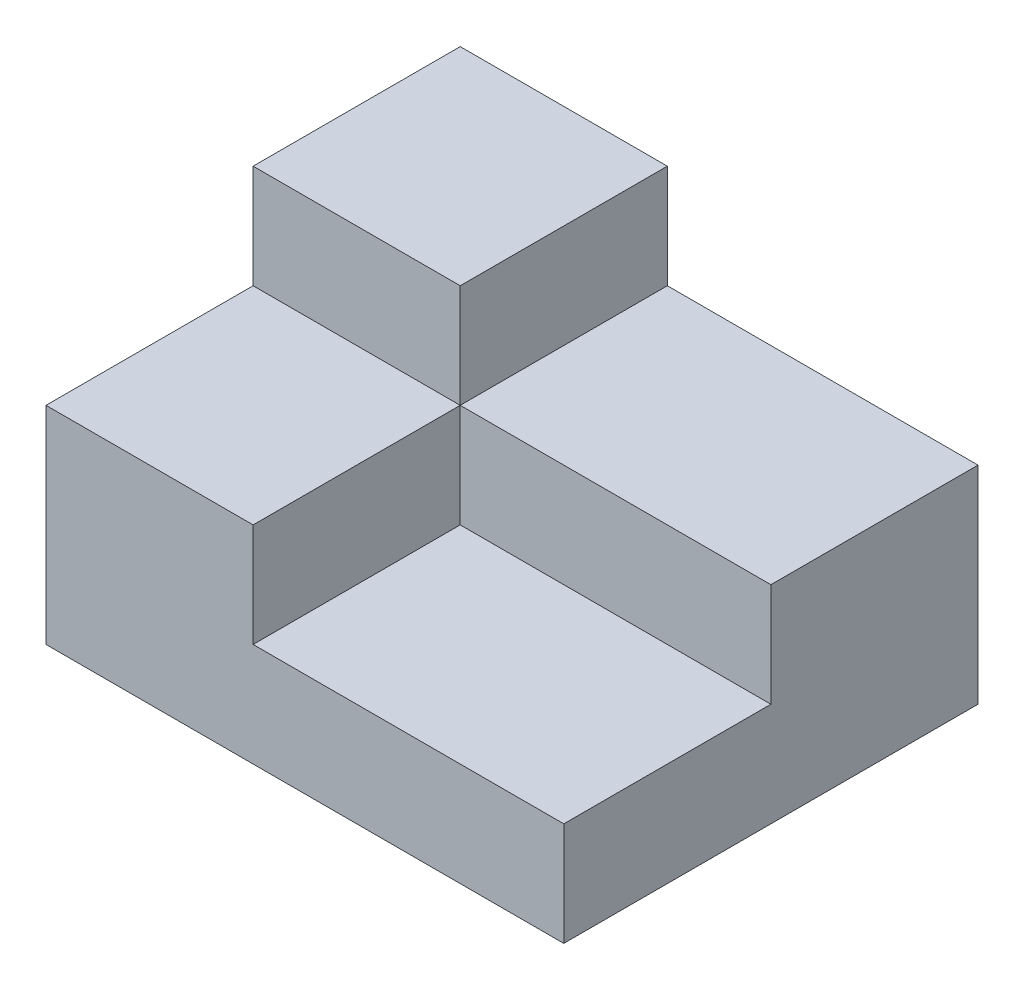
ISO-10303-21;
HEADER;
FILE_DESCRIPTION(('STEP AP214'),'2;1');
FILE_NAME('part.step','',(''),(''),'','','');
FILE_SCHEMA(('AUTOMOTIVE_DESIGN { 1 0 10303 214 1 1 1 1 }'));
ENDSEC;
DATA;
#1=APPLICATION_CONTEXT('core data for automotive mechanical design processes');
#2=APPLICATION_PROTOCOL_DEFINITION('international standard','automotive_design',2000,#1);
#3=PRODUCT_CONTEXT('',#1,'mechanical');
#4=PRODUCT('Part','Part','',(#3));
#5=PRODUCT_RELATED_PRODUCT_CATEGORY('part','',(#4));
#6=PRODUCT_DEFINITION_FORMATION('','',#4);
#7=PRODUCT_DEFINITION_CONTEXT('part definition',#1,'design');
#8=PRODUCT_DEFINITION('design','',#6,#7);
#9=PRODUCT_DEFINITION_SHAPE('','',#8);
#10=(LENGTH_UNIT() NAMED_UNIT(*) SI_UNIT(.MILLI.,.METRE.));
#11=(NAMED_UNIT(*) PLANE_ANGLE_UNIT() SI_UNIT($,.RADIAN.));
#12=(NAMED_UNIT(*) SI_UNIT($,.STERADIAN.) SOLID_ANGLE_UNIT());
#13=UNCERTAINTY_MEASURE_WITH_UNIT(LENGTH_MEASURE(1.E-05),#10,'distance_accuracy_value','');
#14=(GEOMETRIC_REPRESENTATION_CONTEXT(3) GLOBAL_UNCERTAINTY_ASSIGNED_CONTEXT((#13)) GLOBAL_UNIT_ASSIGNED_CONTEXT((#10,
#11,#12)) REPRESENTATION_CONTEXT('',''));
#15=CARTESIAN_POINT('',(0.,0.,0.));
#16=DIRECTION('',(0.,0.,1.));
#17=DIRECTION('',(1.,0.,0.));
#18=AXIS2_PLACEMENT_3D('',#15,#16,#17);
#19=CARTESIAN_POINT('',(0.,50.8,0.));
#20=DIRECTION('',(0.,1.,0.));
#21=DIRECTION('',(0.,0.,1.));
#22=AXIS2_PLACEMENT_3D('',#19,#20,#21);
#23=PLANE('',#22);
#24=DIRECTION('',(0.,0.,-1.));
#25=VECTOR('',#24,1.);
#26=CARTESIAN_POINT('',(-12.7,50.8,-50.8));
#27=LINE('',#26,#25);
#28=CARTESIAN_POINT('',(-12.7,50.8,0.));
#29=VERTEX_POINT('',#28);
#30=CARTESIAN_POINT('',(-12.7,50.8,-50.8));
#31=VERTEX_POINT('',#30);
#32=EDGE_CURVE('E135',#29,#31,#27,.T.);
#33=ORIENTED_EDGE('',*,*,#32,.F.);
#34=DIRECTION('',(1.,0.,0.));
#35=VECTOR('',#34,1.);
#36=CARTESIAN_POINT('',(63.5,50.8,0.));
#37=LINE('',#36,#35);
#38=CARTESIAN_POINT('',(63.5,50.8,0.));
#39=VERTEX_POINT('',#38);
#40=EDGE_CURVE('E154',#29,#39,#37,.T.);
#41=ORIENTED_EDGE('',*,*,#40,.T.);
#42=DIRECTION('',(0.,0.,-1.));
#43=VECTOR('',#42,1.);
#44=CARTESIAN_POINT('',(63.5,50.8,-50.8));
#45=LINE('',#44,#43);
#46=CARTESIAN_POINT('',(63.5,50.8,-50.8));
#47=VERTEX_POINT('',#46);
#48=EDGE_CURVE('E156',#39,#47,#45,.T.);
#49=ORIENTED_EDGE('',*,*,#48,.T.);
#50=DIRECTION('',(-1.,0.,0.));
#51=VECTOR('',#50,1.);
#52=CARTESIAN_POINT('',(63.5,50.8,-50.8));
#53=LINE('',#52,#51);
#54=EDGE_CURVE('E54',#47,#31,#53,.T.);
#55=ORIENTED_EDGE('',*,*,#54,.T.);
#56=EDGE_LOOP('',(#33,#41,#49,#55));
#57=FACE_BOUND('',#56,.T.);
#58=ADVANCED_FACE('F39',(#57),#23,.T.);
#59=CARTESIAN_POINT('',(0.,25.4,0.));
#60=DIRECTION('',(0.,-1.,0.));
#61=DIRECTION('',(0.,0.,-1.));
#62=AXIS2_PLACEMENT_3D('',#59,#60,#61);
#63=PLANE('',#62);
#64=DIRECTION('',(1.,0.,0.));
#65=VECTOR('',#64,1.);
#66=CARTESIAN_POINT('',(63.5,25.4,0.));
#67=LINE('',#66,#65);
#68=CARTESIAN_POINT('',(-12.7,25.4,0.));
#69=VERTEX_POINT('',#68);
#70=CARTESIAN_POINT('',(63.5,25.4,0.));
#71=VERTEX_POINT('',#70);
#72=EDGE_CURVE('E143',#69,#71,#67,.T.);
#73=ORIENTED_EDGE('',*,*,#72,.F.);
#74=DIRECTION('',(0.,0.,-1.));
#75=VECTOR('',#74,1.);
#76=CARTESIAN_POINT('',(-12.7,25.4,0.));
#77=LINE('',#76,#75);
#78=CARTESIAN_POINT('',(-12.7,25.4,50.8));
#79=VERTEX_POINT('',#78);
#80=EDGE_CURVE('E140',#79,#69,#77,.T.);
#81=ORIENTED_EDGE('',*,*,#80,.F.);
#82=DIRECTION('',(1.,0.,0.));
#83=VECTOR('',#82,1.);
#84=CARTESIAN_POINT('',(-63.5,25.4,50.8));
#85=LINE('',#84,#83);
#86=CARTESIAN_POINT('',(63.5,25.4,50.8));
#87=VERTEX_POINT('',#86);
#88=EDGE_CURVE('E173',#79,#87,#85,.T.);
#89=ORIENTED_EDGE('',*,*,#88,.T.);
#90=DIRECTION('',(0.,0.,-1.));
#91=VECTOR('',#90,1.);
#92=CARTESIAN_POINT('',(63.5,25.4,50.8));
#93=LINE('',#92,#91);
#94=EDGE_CURVE('E171',#87,#71,#93,.T.);
#95=ORIENTED_EDGE('',*,*,#94,.T.);
#96=EDGE_LOOP('',(#73,#81,#89,#95));
#97=FACE_BOUND('',#96,.T.);
#98=ADVANCED_FACE('F204',(#97),#63,.F.);
#99=CARTESIAN_POINT('',(63.5,25.4,50.8));
#100=DIRECTION('',(-1.,0.,0.));
#101=DIRECTION('',(0.,0.,1.));
#102=AXIS2_PLACEMENT_3D('',#99,#100,#101);
#103=PLANE('',#102);
#104=DIRECTION('',(0.,0.,-1.));
#105=VECTOR('',#104,1.);
#106=CARTESIAN_POINT('',(63.5,0.,50.8));
#107=LINE('',#106,#105);
#108=CARTESIAN_POINT('',(63.5,0.,50.8));
#109=VERTEX_POINT('',#108);
#110=CARTESIAN_POINT('',(63.5,0.,-50.8));
#111=VERTEX_POINT('',#110);
#112=EDGE_CURVE('E170',#109,#111,#107,.T.);
#113=ORIENTED_EDGE('',*,*,#112,.T.);
#114=DIRECTION('',(0.,-1.,0.));
#115=VECTOR('',#114,1.);
#116=CARTESIAN_POINT('',(63.5,25.4,-50.8));
#117=LINE('',#116,#115);
#118=EDGE_CURVE('E11',#47,#111,#117,.T.);
#119=ORIENTED_EDGE('',*,*,#118,.F.);
#120=ORIENTED_EDGE('',*,*,#48,.F.);
#121=DIRECTION('',(0.,-1.,0.));
#122=VECTOR('',#121,1.);
#123=CARTESIAN_POINT('',(63.5,50.8,0.));
#124=LINE('',#123,#122);
#125=EDGE_CURVE('E158',#39,#71,#124,.T.);
#126=ORIENTED_EDGE('',*,*,#125,.T.);
#127=ORIENTED_EDGE('',*,*,#94,.F.);
#128=DIRECTION('',(0.,-1.,0.));
#129=VECTOR('',#128,1.);
#130=CARTESIAN_POINT('',(63.5,25.4,50.8));
#131=LINE('',#130,#129);
#132=EDGE_CURVE('E176',#87,#109,#131,.T.);
#133=ORIENTED_EDGE('',*,*,#132,.T.);
#134=EDGE_LOOP('',(#113,#119,#120,#126,#127,#133));
#135=FACE_BOUND('',#134,.T.);
#136=ADVANCED_FACE('F41',(#135),#103,.F.);
#137=CARTESIAN_POINT('',(-63.5,25.4,-50.8));
#138=DIRECTION('',(0.,0.,1.));
#139=DIRECTION('',(1.,0.,0.));
#140=AXIS2_PLACEMENT_3D('',#137,#138,#139);
#141=PLANE('',#140);
#142=DIRECTION('',(-1.,0.,0.));
#143=VECTOR('',#142,1.);
#144=CARTESIAN_POINT('',(-63.5,0.,-50.8));
#145=LINE('',#144,#143);
#146=CARTESIAN_POINT('',(-63.5,0.,-50.8));
#147=VERTEX_POINT('',#146);
#148=EDGE_CURVE('E179',#111,#147,#145,.T.);
#149=ORIENTED_EDGE('',*,*,#148,.T.);
#150=DIRECTION('',(0.,-1.,0.));
#151=VECTOR('',#150,1.);
#152=CARTESIAN_POINT('',(-63.5,25.4,-50.8));
#153=LINE('',#152,#151);
#154=CARTESIAN_POINT('',(-63.5,76.2,-50.8));
#155=VERTEX_POINT('',#154);
#156=EDGE_CURVE('E47',#155,#147,#153,.T.);
#157=ORIENTED_EDGE('',*,*,#156,.F.);
#158=DIRECTION('',(-1.,0.,0.));
#159=VECTOR('',#158,1.);
#160=CARTESIAN_POINT('',(-63.5,76.2,-50.8));
#161=LINE('',#160,#159);
#162=CARTESIAN_POINT('',(-12.7,76.2,-50.8));
#163=VERTEX_POINT('',#162);
#164=EDGE_CURVE('E132',#163,#155,#161,.T.);
#165=ORIENTED_EDGE('',*,*,#164,.F.);
#166=DIRECTION('',(0.,-1.,0.));
#167=VECTOR('',#166,1.);
#168=CARTESIAN_POINT('',(-12.7,76.2,-50.8));
#169=LINE('',#168,#167);
#170=EDGE_CURVE('E145',#163,#31,#169,.T.);
#171=ORIENTED_EDGE('',*,*,#170,.T.);
#172=ORIENTED_EDGE('',*,*,#54,.F.);
#173=ORIENTED_EDGE('',*,*,#118,.T.);
#174=EDGE_LOOP('',(#149,#157,#165,#171,#172,#173));
#175=FACE_BOUND('',#174,.T.);
#176=ADVANCED_FACE('F221',(#175),#141,.F.);
#177=CARTESIAN_POINT('',(-63.5,25.4,50.8));
#178=DIRECTION('',(1.,0.,0.));
#179=DIRECTION('',(0.,0.,-1.));
#180=AXIS2_PLACEMENT_3D('',#177,#178,#179);
#181=PLANE('',#180);
#182=DIRECTION('',(0.,0.,1.));
#183=VECTOR('',#182,1.);
#184=CARTESIAN_POINT('',(-63.5,0.,50.8));
#185=LINE('',#184,#183);
#186=CARTESIAN_POINT('',(-63.5,0.,50.8));
#187=VERTEX_POINT('',#186);
#188=EDGE_CURVE('E181',#147,#187,#185,.T.);
#189=ORIENTED_EDGE('',*,*,#188,.T.);
#190=DIRECTION('',(0.,-1.,0.));
#191=VECTOR('',#190,1.);
#192=CARTESIAN_POINT('',(-63.5,25.4,50.8));
#193=LINE('',#192,#191);
#194=CARTESIAN_POINT('',(-63.5,50.8,50.8));
#195=VERTEX_POINT('',#194);
#196=EDGE_CURVE('E186',#195,#187,#193,.T.);
#197=ORIENTED_EDGE('',*,*,#196,.F.);
#198=DIRECTION('',(0.,0.,1.));
#199=VECTOR('',#198,1.);
#200=CARTESIAN_POINT('',(-63.5,50.8,-50.8));
#201=LINE('',#200,#199);
#202=CARTESIAN_POINT('',(-63.5,50.8,0.));
#203=VERTEX_POINT('',#202);
#204=EDGE_CURVE('E139',#203,#195,#201,.T.);
#205=ORIENTED_EDGE('',*,*,#204,.F.);
#206=DIRECTION('',(0.,-1.,0.));
#207=VECTOR('',#206,1.);
#208=CARTESIAN_POINT('',(-63.5,76.2,0.));
#209=LINE('',#208,#207);
#210=CARTESIAN_POINT('',(-63.5,76.2,0.));
#211=VERTEX_POINT('',#210);
#212=EDGE_CURVE('E120',#211,#203,#209,.T.);
#213=ORIENTED_EDGE('',*,*,#212,.F.);
#214=DIRECTION('',(0.,0.,1.));
#215=VECTOR('',#214,1.);
#216=CARTESIAN_POINT('',(-63.5,76.2,-50.8));
#217=LINE('',#216,#215);
#218=EDGE_CURVE('E126',#155,#211,#217,.T.);
#219=ORIENTED_EDGE('',*,*,#218,.F.);
#220=ORIENTED_EDGE('',*,*,#156,.T.);
#221=EDGE_LOOP('',(#189,#197,#205,#213,#219,#220));
#222=FACE_BOUND('',#221,.T.);
#223=ADVANCED_FACE('F137',(#222),#181,.F.);
#224=CARTESIAN_POINT('',(-63.5,25.4,50.8));
#225=DIRECTION('',(0.,0.,-1.));
#226=DIRECTION('',(-1.,0.,0.));
#227=AXIS2_PLACEMENT_3D('',#224,#225,#226);
#228=PLANE('',#227);
#229=DIRECTION('',(1.,0.,0.));
#230=VECTOR('',#229,1.);
#231=CARTESIAN_POINT('',(-63.5,0.,50.8));
#232=LINE('',#231,#230);
#233=EDGE_CURVE('E174',#187,#109,#232,.T.);
#234=ORIENTED_EDGE('',*,*,#233,.T.);
#235=ORIENTED_EDGE('',*,*,#132,.F.);
#236=ORIENTED_EDGE('',*,*,#88,.F.);
#237=DIRECTION('',(0.,-1.,0.));
#238=VECTOR('',#237,1.);
#239=CARTESIAN_POINT('',(-12.7,50.8,50.8));
#240=LINE('',#239,#238);
#241=CARTESIAN_POINT('',(-12.7,50.8,50.8));
#242=VERTEX_POINT('',#241);
#243=EDGE_CURVE('E167',#242,#79,#240,.T.);
#244=ORIENTED_EDGE('',*,*,#243,.F.);
#245=DIRECTION('',(1.,0.,0.));
#246=VECTOR('',#245,1.);
#247=CARTESIAN_POINT('',(-63.5,50.8,50.8));
#248=LINE('',#247,#246);
#249=EDGE_CURVE('E150',#195,#242,#248,.T.);
#250=ORIENTED_EDGE('',*,*,#249,.F.);
#251=ORIENTED_EDGE('',*,*,#196,.T.);
#252=EDGE_LOOP('',(#234,#235,#236,#244,#250,#251));
#253=FACE_BOUND('',#252,.T.);
#254=ADVANCED_FACE('F196',(#253),#228,.F.);
#255=CARTESIAN_POINT('',(0.,0.,0.));
#256=DIRECTION('',(0.,-1.,0.));
#257=DIRECTION('',(0.,0.,-1.));
#258=AXIS2_PLACEMENT_3D('',#255,#256,#257);
#259=PLANE('',#258);
#260=ORIENTED_EDGE('',*,*,#112,.F.);
#261=ORIENTED_EDGE('',*,*,#233,.F.);
#262=ORIENTED_EDGE('',*,*,#188,.F.);
#263=ORIENTED_EDGE('',*,*,#148,.F.);
#264=EDGE_LOOP('',(#260,#261,#262,#263));
#265=FACE_BOUND('',#264,.T.);
#266=ADVANCED_FACE('F193',(#265),#259,.T.);
#267=CARTESIAN_POINT('',(-12.7,50.8,0.));
#268=DIRECTION('',(-1.,0.,0.));
#269=DIRECTION('',(0.,0.,1.));
#270=AXIS2_PLACEMENT_3D('',#267,#268,#269);
#271=PLANE('',#270);
#272=ORIENTED_EDGE('',*,*,#80,.T.);
#273=DIRECTION('',(0.,-1.,0.));
#274=VECTOR('',#273,1.);
#275=CARTESIAN_POINT('',(-12.7,50.8,0.));
#276=LINE('',#275,#274);
#277=EDGE_CURVE('E164',#29,#69,#276,.T.);
#278=ORIENTED_EDGE('',*,*,#277,.F.);
#279=DIRECTION('',(0.,0.,-1.));
#280=VECTOR('',#279,1.);
#281=CARTESIAN_POINT('',(-12.7,50.8,0.));
#282=LINE('',#281,#280);
#283=EDGE_CURVE('E152',#242,#29,#282,.T.);
#284=ORIENTED_EDGE('',*,*,#283,.F.);
#285=ORIENTED_EDGE('',*,*,#243,.T.);
#286=EDGE_LOOP('',(#272,#278,#284,#285));
#287=FACE_BOUND('',#286,.T.);
#288=ADVANCED_FACE('F210',(#287),#271,.F.);
#289=CARTESIAN_POINT('',(63.5,50.8,0.));
#290=DIRECTION('',(0.,0.,-1.));
#291=DIRECTION('',(-1.,0.,0.));
#292=AXIS2_PLACEMENT_3D('',#289,#290,#291);
#293=PLANE('',#292);
#294=ORIENTED_EDGE('',*,*,#72,.T.);
#295=ORIENTED_EDGE('',*,*,#125,.F.);
#296=ORIENTED_EDGE('',*,*,#40,.F.);
#297=ORIENTED_EDGE('',*,*,#277,.T.);
#298=EDGE_LOOP('',(#294,#295,#296,#297));
#299=FACE_BOUND('',#298,.T.);
#300=ADVANCED_FACE('F206',(#299),#293,.F.);
#301=DIRECTION('',(1.,0.,0.));
#302=VECTOR('',#301,1.);
#303=CARTESIAN_POINT('',(-63.5,50.8,0.));
#304=LINE('',#303,#302);
#305=EDGE_CURVE('E62',#203,#29,#304,.T.);
#306=ORIENTED_EDGE('',*,*,#305,.F.);
#307=ORIENTED_EDGE('',*,*,#204,.T.);
#308=ORIENTED_EDGE('',*,*,#249,.T.);
#309=ORIENTED_EDGE('',*,*,#283,.T.);
#310=EDGE_LOOP('',(#306,#307,#308,#309));
#311=FACE_BOUND('',#310,.T.);
#312=ADVANCED_FACE('F211',(#311),#23,.T.);
#313=CARTESIAN_POINT('',(-63.5,76.2,0.));
#314=DIRECTION('',(0.,0.,-1.));
#315=DIRECTION('',(-1.,0.,0.));
#316=AXIS2_PLACEMENT_3D('',#313,#314,#315);
#317=PLANE('',#316);
#318=ORIENTED_EDGE('',*,*,#305,.T.);
#319=DIRECTION('',(0.,-1.,0.));
#320=VECTOR('',#319,1.);
#321=CARTESIAN_POINT('',(-12.7,76.2,0.));
#322=LINE('',#321,#320);
#323=CARTESIAN_POINT('',(-12.7,76.2,0.));
#324=VERTEX_POINT('',#323);
#325=EDGE_CURVE('E122',#324,#29,#322,.T.);
#326=ORIENTED_EDGE('',*,*,#325,.F.);
#327=DIRECTION('',(1.,0.,0.));
#328=VECTOR('',#327,1.);
#329=CARTESIAN_POINT('',(-63.5,76.2,0.));
#330=LINE('',#329,#328);
#331=EDGE_CURVE('E116',#211,#324,#330,.T.);
#332=ORIENTED_EDGE('',*,*,#331,.F.);
#333=ORIENTED_EDGE('',*,*,#212,.T.);
#334=EDGE_LOOP('',(#318,#326,#332,#333));
#335=FACE_BOUND('',#334,.T.);
#336=ADVANCED_FACE('F118',(#335),#317,.F.);
#337=CARTESIAN_POINT('',(-12.7,76.2,-50.8));
#338=DIRECTION('',(-1.,0.,0.));
#339=DIRECTION('',(0.,0.,1.));
#340=AXIS2_PLACEMENT_3D('',#337,#338,#339);
#341=PLANE('',#340);
#342=ORIENTED_EDGE('',*,*,#32,.T.);
#343=ORIENTED_EDGE('',*,*,#170,.F.);
#344=DIRECTION('',(0.,0.,-1.));
#345=VECTOR('',#344,1.);
#346=CARTESIAN_POINT('',(-12.7,76.2,-50.8));
#347=LINE('',#346,#345);
#348=EDGE_CURVE('E125',#324,#163,#347,.T.);
#349=ORIENTED_EDGE('',*,*,#348,.F.);
#350=ORIENTED_EDGE('',*,*,#325,.T.);
#351=EDGE_LOOP('',(#342,#343,#349,#350));
#352=FACE_BOUND('',#351,.T.);
#353=ADVANCED_FACE('F218',(#352),#341,.F.);
#354=CARTESIAN_POINT('',(0.,76.2,0.));
#355=DIRECTION('',(0.,1.,0.));
#356=DIRECTION('',(0.,0.,1.));
#357=AXIS2_PLACEMENT_3D('',#354,#355,#356);
#358=PLANE('',#357);
#359=ORIENTED_EDGE('',*,*,#218,.T.);
#360=ORIENTED_EDGE('',*,*,#331,.T.);
#361=ORIENTED_EDGE('',*,*,#348,.T.);
#362=ORIENTED_EDGE('',*,*,#164,.T.);
#363=EDGE_LOOP('',(#359,#360,#361,#362));
#364=FACE_BOUND('',#363,.T.);
#365=ADVANCED_FACE('F130',(#364),#358,.T.);
#366=CLOSED_SHELL('',(#58,#98,#136,#176,#223,#254,#266,#288,#300,#312,#336,#353,#365));
#367=MANIFOLD_SOLID_BREP('B2',#366);
#368=ADVANCED_BREP_SHAPE_REPRESENTATION('',(#18,#367),#14);
#369=SHAPE_DEFINITION_REPRESENTATION(#9,#368);
ENDSEC;
END-ISO-10303-21;
